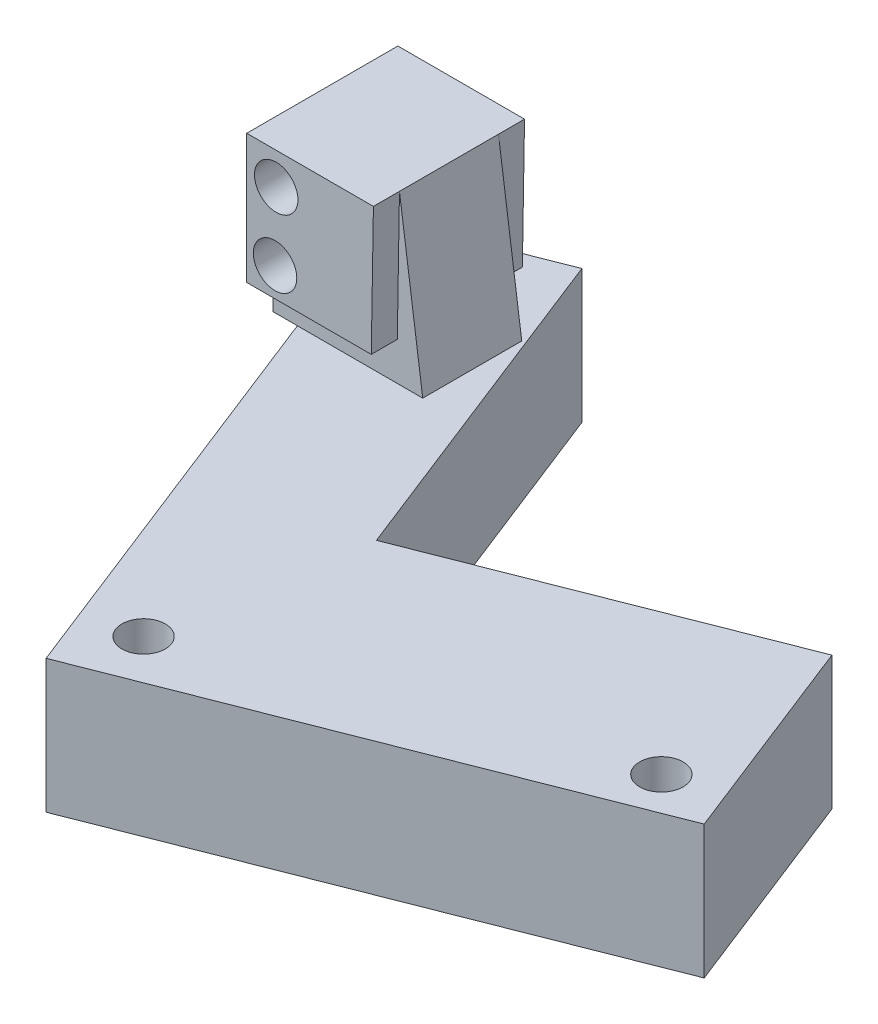
ISO-10303-21;
HEADER;
FILE_DESCRIPTION(('STEP AP214'),'2;1');
FILE_NAME('part.step','',(''),(''),'','','');
FILE_SCHEMA(('AUTOMOTIVE_DESIGN { 1 0 10303 214 1 1 1 1 }'));
ENDSEC;
DATA;
#1=APPLICATION_CONTEXT('core data for automotive mechanical design processes');
#2=APPLICATION_PROTOCOL_DEFINITION('international standard','automotive_design',2000,#1);
#3=PRODUCT_CONTEXT('',#1,'mechanical');
#4=PRODUCT('Part','Part','',(#3));
#5=PRODUCT_RELATED_PRODUCT_CATEGORY('part','',(#4));
#6=PRODUCT_DEFINITION_FORMATION('','',#4);
#7=PRODUCT_DEFINITION_CONTEXT('part definition',#1,'design');
#8=PRODUCT_DEFINITION('design','',#6,#7);
#9=PRODUCT_DEFINITION_SHAPE('','',#8);
#10=(LENGTH_UNIT() NAMED_UNIT(*) SI_UNIT(.MILLI.,.METRE.));
#11=(NAMED_UNIT(*) PLANE_ANGLE_UNIT() SI_UNIT($,.RADIAN.));
#12=(NAMED_UNIT(*) SI_UNIT($,.STERADIAN.) SOLID_ANGLE_UNIT());
#13=UNCERTAINTY_MEASURE_WITH_UNIT(LENGTH_MEASURE(1.E-05),#10,'distance_accuracy_value','');
#14=(GEOMETRIC_REPRESENTATION_CONTEXT(3) GLOBAL_UNCERTAINTY_ASSIGNED_CONTEXT((#13)) GLOBAL_UNIT_ASSIGNED_CONTEXT((#10,
#11,#12)) REPRESENTATION_CONTEXT('',''));
#15=CARTESIAN_POINT('',(0.,0.,0.));
#16=DIRECTION('',(0.,0.,1.));
#17=DIRECTION('',(1.,0.,0.));
#18=AXIS2_PLACEMENT_3D('',#15,#16,#17);
#19=CARTESIAN_POINT('',(449.174121077904,-7.46907661315017,-54.397912950041));
#20=DIRECTION('',(0.999861775722981,-0.0166261675706381,0.));
#21=DIRECTION('',(0.0166261675706381,0.999861775722981,0.));
#22=AXIS2_PLACEMENT_3D('',#19,#20,#21);
#23=PLANE('',#22);
#24=DIRECTION('',(0.,0.,1.));
#25=VECTOR('',#24,1.);
#26=CARTESIAN_POINT('',(451.546293611045,135.188251434978,-54.397912950041));
#27=LINE('',#26,#25);
#28=CARTESIAN_POINT('',(451.546293611045,135.188251434978,-3.81));
#29=VERTEX_POINT('',#28);
#30=CARTESIAN_POINT('',(451.546293611045,135.188251434978,0.));
#31=VERTEX_POINT('',#30);
#32=EDGE_CURVE('E234',#29,#31,#27,.T.);
#33=ORIENTED_EDGE('',*,*,#32,.T.);
#34=DIRECTION('',(-0.0166261675706381,-0.999861775722981,0.));
#35=VECTOR('',#34,1.);
#36=CARTESIAN_POINT('',(449.174121077904,-7.46907661315017,0.));
#37=LINE('',#36,#35);
#38=CARTESIAN_POINT('',(451.232045854327,116.29007067776,0.));
#39=VERTEX_POINT('',#38);
#40=EDGE_CURVE('E267',#31,#39,#37,.T.);
#41=ORIENTED_EDGE('',*,*,#40,.T.);
#42=DIRECTION('',(0.,0.,-1.));
#43=VECTOR('',#42,1.);
#44=CARTESIAN_POINT('',(451.232045854327,116.29007067776,-54.397912950041));
#45=LINE('',#44,#43);
#46=CARTESIAN_POINT('',(451.232045854327,116.29007067776,-3.81));
#47=VERTEX_POINT('',#46);
#48=EDGE_CURVE('E199',#39,#47,#45,.T.);
#49=ORIENTED_EDGE('',*,*,#48,.T.);
#50=DIRECTION('',(-0.0166261675706309,-0.999861775722981,0.));
#51=VECTOR('',#50,1.);
#52=CARTESIAN_POINT('',(451.546293611045,135.188251434978,-3.81));
#53=LINE('',#52,#51);
#54=EDGE_CURVE('E179',#29,#47,#53,.T.);
#55=ORIENTED_EDGE('',*,*,#54,.F.);
#56=EDGE_LOOP('',(#33,#41,#49,#55));
#57=FACE_BOUND('',#56,.T.);
#58=ADVANCED_FACE('F45',(#57),#23,.T.);
#59=DIRECTION('',(0.,0.,-1.));
#60=VECTOR('',#59,1.);
#61=CARTESIAN_POINT('',(451.232045854327,116.29007067776,-54.397912950041));
#62=LINE('',#61,#60);
#63=CARTESIAN_POINT('',(451.232045854327,116.29007067776,-18.2879999999998));
#64=VERTEX_POINT('',#63);
#65=CARTESIAN_POINT('',(451.232045854327,116.29007067776,-22.0979999999998));
#66=VERTEX_POINT('',#65);
#67=EDGE_CURVE('E196',#64,#66,#62,.T.);
#68=ORIENTED_EDGE('',*,*,#67,.T.);
#69=DIRECTION('',(0.0166261675706381,0.999861775722981,0.));
#70=VECTOR('',#69,1.);
#71=CARTESIAN_POINT('',(449.174121077904,-7.46907661315017,-22.0979999999998));
#72=LINE('',#71,#70);
#73=CARTESIAN_POINT('',(451.546293611045,135.188251434978,-22.0979999999998));
#74=VERTEX_POINT('',#73);
#75=EDGE_CURVE('E277',#66,#74,#72,.T.);
#76=ORIENTED_EDGE('',*,*,#75,.T.);
#77=CARTESIAN_POINT('',(451.546293611045,135.188251434978,-18.2879999999998));
#78=VERTEX_POINT('',#77);
#79=EDGE_CURVE('E272',#74,#78,#27,.T.);
#80=ORIENTED_EDGE('',*,*,#79,.T.);
#81=DIRECTION('',(-0.0166261675706309,-0.999861775722981,0.));
#82=VECTOR('',#81,1.);
#83=CARTESIAN_POINT('',(451.546293611045,135.188251434978,-18.2879999999998));
#84=LINE('',#83,#82);
#85=EDGE_CURVE('E165',#78,#64,#84,.T.);
#86=ORIENTED_EDGE('',*,*,#85,.T.);
#87=EDGE_LOOP('',(#68,#76,#80,#86));
#88=FACE_BOUND('',#87,.T.);
#89=ADVANCED_FACE('F300',(#88),#23,.T.);
#90=CARTESIAN_POINT('',(0.,110.70207067776,-2.32437182998327E-13));
#91=DIRECTION('',(0.,-1.,0.));
#92=DIRECTION('',(0.,0.,1.));
#93=AXIS2_PLACEMENT_3D('',#90,#91,#92);
#94=PLANE('',#93);
#95=CARTESIAN_POINT('',(464.715754045119,110.70207067776,46.7775128305649));
#96=DIRECTION('',(0.,-1.,0.));
#97=DIRECTION('',(0.,0.,-1.));
#98=AXIS2_PLACEMENT_3D('',#95,#96,#97);
#99=CIRCLE('',#98,3.17499999999997);
#100=CARTESIAN_POINT('',(464.715754045119,110.70207067776,43.6025128305649));
#101=VERTEX_POINT('',#100);
#102=EDGE_CURVE('E227',#101,#101,#99,.T.);
#103=ORIENTED_EDGE('',*,*,#102,.T.);
#104=EDGE_LOOP('',(#103));
#105=FACE_BOUND('',#104,.T.);
#106=CARTESIAN_POINT('',(520.043156994336,110.70207067776,26.3896372008954));
#107=DIRECTION('',(0.,-1.,0.));
#108=DIRECTION('',(0.,0.,-1.));
#109=AXIS2_PLACEMENT_3D('',#106,#107,#108);
#110=CIRCLE('',#109,3.17499999999997);
#111=CARTESIAN_POINT('',(520.043156994336,110.70207067776,23.2146372008955));
#112=VERTEX_POINT('',#111);
#113=EDGE_CURVE('E224',#112,#112,#110,.T.);
#114=ORIENTED_EDGE('',*,*,#113,.T.);
#115=EDGE_LOOP('',(#114));
#116=FACE_BOUND('',#115,.T.);
#117=DIRECTION('',(-1.,0.,0.));
#118=VECTOR('',#117,1.);
#119=CARTESIAN_POINT('',(459.183837090521,110.70207067776,-3.81));
#120=LINE('',#119,#118);
#121=CARTESIAN_POINT('',(454.94912598616,110.702070677759,-3.81));
#122=VERTEX_POINT('',#121);
#123=CARTESIAN_POINT('',(436.620084468477,110.70207067776,-3.81));
#124=VERTEX_POINT('',#123);
#125=EDGE_CURVE('E544',#122,#124,#120,.T.);
#126=ORIENTED_EDGE('',*,*,#125,.T.);
#127=DIRECTION('',(-0.365302013902893,0.,-0.930889058179593));
#128=VECTOR('',#127,1.);
#129=CARTESIAN_POINT('',(428.888999662309,110.70207067776,-23.5109104248551));
#130=LINE('',#129,#128);
#131=CARTESIAN_POINT('',(460.355497652672,110.70207067776,56.6742995210325));
#132=VERTEX_POINT('',#131);
#133=EDGE_CURVE('E53',#132,#124,#130,.T.);
#134=ORIENTED_EDGE('',*,*,#133,.F.);
#135=DIRECTION('',(-0.930889058179593,0.,0.365302013902894));
#136=VECTOR('',#135,1.);
#137=CARTESIAN_POINT('',(460.355497652672,110.70207067776,56.6742995210325));
#138=LINE('',#137,#136);
#139=CARTESIAN_POINT('',(529.469948870299,110.70207067776,29.5522187556127));
#140=VERTEX_POINT('',#139);
#141=EDGE_CURVE('E204',#140,#132,#138,.T.);
#142=ORIENTED_EDGE('',*,*,#141,.F.);
#143=DIRECTION('',(0.365302013902893,0.,0.930889058179593));
#144=VECTOR('',#143,1.);
#145=CARTESIAN_POINT('',(529.469948870299,110.70207067776,29.5522187556127));
#146=LINE('',#145,#144);
#147=CARTESIAN_POINT('',(517.407676371226,110.70207067776,-1.18573794547745));
#148=VERTEX_POINT('',#147);
#149=EDGE_CURVE('E208',#148,#140,#146,.T.);
#150=ORIENTED_EDGE('',*,*,#149,.F.);
#151=DIRECTION('',(0.930889058179593,0.,-0.365302013902894));
#152=VECTOR('',#151,1.);
#153=CARTESIAN_POINT('',(517.407676371226,110.70207067776,-1.18573794547745));
#154=LINE('',#153,#152);
#155=CARTESIAN_POINT('',(469.573349023584,110.70207067776,17.5855387821221));
#156=VERTEX_POINT('',#155);
#157=EDGE_CURVE('E211',#156,#148,#154,.T.);
#158=ORIENTED_EDGE('',*,*,#157,.F.);
#159=DIRECTION('',(0.365302013902893,0.,0.930889058179594));
#160=VECTOR('',#159,1.);
#161=CARTESIAN_POINT('',(469.573349023584,110.70207067776,17.5855387821221));
#162=LINE('',#161,#160);
#163=CARTESIAN_POINT('',(450.169123532295,110.70207067776,-31.8617144626753));
#164=VERTEX_POINT('',#163);
#165=EDGE_CURVE('E214',#164,#156,#162,.T.);
#166=ORIENTED_EDGE('',*,*,#165,.F.);
#167=DIRECTION('',(0.930889058179594,0.,-0.365302013902893));
#168=VECTOR('',#167,1.);
#169=CARTESIAN_POINT('',(450.169123532295,110.70207067776,-31.8617144626753));
#170=LINE('',#169,#168);
#171=CARTESIAN_POINT('',(428.888999662309,110.70207067776,-23.5109104248551));
#172=VERTEX_POINT('',#171);
#173=EDGE_CURVE('E217',#172,#164,#170,.T.);
#174=ORIENTED_EDGE('',*,*,#173,.F.);
#175=CARTESIAN_POINT('',(433.021837090521,110.702070677759,-12.9793146637115));
#176=VERTEX_POINT('',#175);
#177=EDGE_CURVE('E220',#176,#172,#130,.T.);
#178=ORIENTED_EDGE('',*,*,#177,.F.);
#179=DIRECTION('',(0.,0.,1.));
#180=VECTOR('',#179,1.);
#181=CARTESIAN_POINT('',(433.021837090521,110.702070677759,-28.702));
#182=LINE('',#181,#180);
#183=CARTESIAN_POINT('',(433.021837090521,110.702070677759,-18.2879999999998));
#184=VERTEX_POINT('',#183);
#185=EDGE_CURVE('E184',#184,#176,#182,.T.);
#186=ORIENTED_EDGE('',*,*,#185,.F.);
#187=DIRECTION('',(-1.,0.,0.));
#188=VECTOR('',#187,1.);
#189=CARTESIAN_POINT('',(459.183837090521,110.70207067776,-18.2879999999998));
#190=LINE('',#189,#188);
#191=CARTESIAN_POINT('',(454.94912598616,110.702070677759,-18.2879999999998));
#192=VERTEX_POINT('',#191);
#193=EDGE_CURVE('E162',#192,#184,#190,.T.);
#194=ORIENTED_EDGE('',*,*,#193,.F.);
#195=DIRECTION('',(0.,0.,-1.));
#196=VECTOR('',#195,1.);
#197=CARTESIAN_POINT('',(454.94912598616,110.702070677759,20.9708221831963));
#198=LINE('',#197,#196);
#199=EDGE_CURVE('E173',#122,#192,#198,.T.);
#200=ORIENTED_EDGE('',*,*,#199,.F.);
#201=EDGE_LOOP('',(#126,#134,#142,#150,#158,#166,#174,#178,#186,#194,#200));
#202=FACE_BOUND('',#201,.T.);
#203=ADVANCED_FACE('F181',(#105,#116,#202),#94,.F.);
#204=CARTESIAN_POINT('',(0.,110.70207067776,-54.397912950041));
#205=DIRECTION('',(0.,-1.,0.));
#206=DIRECTION('',(0.,0.,1.));
#207=AXIS2_PLACEMENT_3D('',#204,#205,#206);
#208=PLANE('',#207);
#209=CARTESIAN_POINT('',(433.021837090521,110.702070677759,-3.81));
#210=VERTEX_POINT('',#209);
#211=EDGE_CURVE('E563',#176,#210,#182,.T.);
#212=ORIENTED_EDGE('',*,*,#211,.F.);
#213=EDGE_CURVE('E221',#124,#176,#130,.T.);
#214=ORIENTED_EDGE('',*,*,#213,.F.);
#215=EDGE_CURVE('E564',#124,#210,#120,.T.);
#216=ORIENTED_EDGE('',*,*,#215,.T.);
#217=EDGE_LOOP('',(#212,#214,#216));
#218=FACE_BOUND('',#217,.T.);
#219=ADVANCED_FACE('F311',(#218),#208,.T.);
#220=CARTESIAN_POINT('',(0.,135.188251434978,-54.397912950041));
#221=DIRECTION('',(0.,1.,0.));
#222=DIRECTION('',(0.,0.,-1.));
#223=AXIS2_PLACEMENT_3D('',#220,#221,#222);
#224=PLANE('',#223);
#225=DIRECTION('',(0.,0.,1.));
#226=VECTOR('',#225,1.);
#227=CARTESIAN_POINT('',(433.021837090521,135.188251434978,-28.702));
#228=LINE('',#227,#226);
#229=CARTESIAN_POINT('',(433.021837090521,135.188251434978,-22.0979999999998));
#230=VERTEX_POINT('',#229);
#231=CARTESIAN_POINT('',(433.021837090521,135.188251434978,0.));
#232=VERTEX_POINT('',#231);
#233=EDGE_CURVE('E568',#230,#232,#228,.T.);
#234=ORIENTED_EDGE('',*,*,#233,.T.);
#235=DIRECTION('',(1.,0.,0.));
#236=VECTOR('',#235,1.);
#237=CARTESIAN_POINT('',(0.,135.188251434978,0.));
#238=LINE('',#237,#236);
#239=EDGE_CURVE('E270',#232,#31,#238,.T.);
#240=ORIENTED_EDGE('',*,*,#239,.T.);
#241=ORIENTED_EDGE('',*,*,#32,.F.);
#242=DIRECTION('',(0.,0.,-1.));
#243=VECTOR('',#242,1.);
#244=CARTESIAN_POINT('',(451.546293611045,135.188251434978,20.9708221831963));
#245=LINE('',#244,#243);
#246=EDGE_CURVE('E170',#29,#78,#245,.T.);
#247=ORIENTED_EDGE('',*,*,#246,.T.);
#248=ORIENTED_EDGE('',*,*,#79,.F.);
#249=DIRECTION('',(-1.,0.,0.));
#250=VECTOR('',#249,1.);
#251=CARTESIAN_POINT('',(0.,135.188251434978,-22.0979999999998));
#252=LINE('',#251,#250);
#253=EDGE_CURVE('E67',#74,#230,#252,.T.);
#254=ORIENTED_EDGE('',*,*,#253,.T.);
#255=EDGE_LOOP('',(#234,#240,#241,#247,#248,#254));
#256=FACE_BOUND('',#255,.T.);
#257=ADVANCED_FACE('F314',(#256),#224,.T.);
#258=CARTESIAN_POINT('',(437.164813365978,120.500000000002,-54.397912950041));
#259=DIRECTION('',(0.,0.,1.));
#260=DIRECTION('',(-1.,0.,0.));
#261=AXIS2_PLACEMENT_3D('',#258,#259,#260);
#262=CYLINDRICAL_SURFACE('',#261,3.17500000000002);
#263=CARTESIAN_POINT('',(437.164813365978,120.500000000002,-22.0979999999998));
#264=DIRECTION('',(0.,0.,-1.));
#265=DIRECTION('',(-1.,0.,0.));
#266=AXIS2_PLACEMENT_3D('',#263,#264,#265);
#267=CIRCLE('',#266,3.17500000000002);
#268=CARTESIAN_POINT('',(433.989813365978,120.500000000002,-22.0979999999998));
#269=VERTEX_POINT('',#268);
#270=EDGE_CURVE('E263',#269,#269,#267,.T.);
#271=ORIENTED_EDGE('',*,*,#270,.T.);
#272=EDGE_LOOP('',(#271));
#273=FACE_BOUND('',#272,.T.);
#274=CARTESIAN_POINT('',(437.164813365978,120.500000000002,0.));
#275=DIRECTION('',(0.,0.,1.));
#276=DIRECTION('',(1.,0.,0.));
#277=AXIS2_PLACEMENT_3D('',#274,#275,#276);
#278=CIRCLE('',#277,3.17500000000002);
#279=CARTESIAN_POINT('',(440.339813365979,120.500000000002,0.));
#280=VERTEX_POINT('',#279);
#281=EDGE_CURVE('E264',#280,#280,#278,.T.);
#282=ORIENTED_EDGE('',*,*,#281,.T.);
#283=EDGE_LOOP('',(#282));
#284=FACE_BOUND('',#283,.T.);
#285=ADVANCED_FACE('F310',(#273,#284),#262,.F.);
#286=CARTESIAN_POINT('',(437.331098026262,130.500000000002,-54.397912950041));
#287=DIRECTION('',(0.,0.,1.));
#288=DIRECTION('',(-1.,0.,0.));
#289=AXIS2_PLACEMENT_3D('',#286,#287,#288);
#290=CYLINDRICAL_SURFACE('',#289,3.17499999999997);
#291=CARTESIAN_POINT('',(437.331098026262,130.500000000002,-22.0979999999998));
#292=DIRECTION('',(0.,0.,-1.));
#293=DIRECTION('',(-1.,0.,0.));
#294=AXIS2_PLACEMENT_3D('',#291,#292,#293);
#295=CIRCLE('',#294,3.17499999999997);
#296=CARTESIAN_POINT('',(434.156098026262,130.500000000002,-22.0979999999998));
#297=VERTEX_POINT('',#296);
#298=EDGE_CURVE('E223',#297,#297,#295,.T.);
#299=ORIENTED_EDGE('',*,*,#298,.T.);
#300=EDGE_LOOP('',(#299));
#301=FACE_BOUND('',#300,.T.);
#302=CARTESIAN_POINT('',(437.331098026262,130.500000000002,0.));
#303=DIRECTION('',(0.,0.,1.));
#304=DIRECTION('',(1.,0.,0.));
#305=AXIS2_PLACEMENT_3D('',#302,#303,#304);
#306=CIRCLE('',#305,3.17499999999997);
#307=CARTESIAN_POINT('',(440.506098026262,130.500000000002,0.));
#308=VERTEX_POINT('',#307);
#309=EDGE_CURVE('E260',#308,#308,#306,.T.);
#310=ORIENTED_EDGE('',*,*,#309,.T.);
#311=EDGE_LOOP('',(#310));
#312=FACE_BOUND('',#311,.T.);
#313=ADVANCED_FACE('F282',(#301,#312),#290,.F.);
#314=CARTESIAN_POINT('',(0.,0.,0.));
#315=DIRECTION('',(0.,0.,-1.));
#316=DIRECTION('',(1.,0.,0.));
#317=AXIS2_PLACEMENT_3D('',#314,#315,#316);
#318=PLANE('',#317);
#319=DIRECTION('',(-1.,0.,0.));
#320=VECTOR('',#319,1.);
#321=CARTESIAN_POINT('',(459.183837090521,116.29007067776,0.));
#322=LINE('',#321,#320);
#323=CARTESIAN_POINT('',(433.021837090521,116.29007067776,0.));
#324=VERTEX_POINT('',#323);
#325=EDGE_CURVE('E200',#39,#324,#322,.T.);
#326=ORIENTED_EDGE('',*,*,#325,.F.);
#327=ORIENTED_EDGE('',*,*,#40,.F.);
#328=ORIENTED_EDGE('',*,*,#239,.F.);
#329=DIRECTION('',(0.,-1.,0.));
#330=VECTOR('',#329,1.);
#331=CARTESIAN_POINT('',(433.021837090521,135.188251434978,0.));
#332=LINE('',#331,#330);
#333=EDGE_CURVE('E565',#232,#324,#332,.T.);
#334=ORIENTED_EDGE('',*,*,#333,.T.);
#335=EDGE_LOOP('',(#326,#327,#328,#334));
#336=FACE_BOUND('',#335,.T.);
#337=ORIENTED_EDGE('',*,*,#281,.F.);
#338=EDGE_LOOP('',(#337));
#339=FACE_BOUND('',#338,.T.);
#340=ORIENTED_EDGE('',*,*,#309,.F.);
#341=EDGE_LOOP('',(#340));
#342=FACE_BOUND('',#341,.T.);
#343=ADVANCED_FACE('F287',(#336,#339,#342),#318,.F.);
#344=CARTESIAN_POINT('',(405.259993131351,116.453404428401,-22.0979999999998));
#345=DIRECTION('',(0.,0.,1.));
#346=DIRECTION('',(-1.,0.,0.));
#347=AXIS2_PLACEMENT_3D('',#344,#345,#346);
#348=PLANE('',#347);
#349=ORIENTED_EDGE('',*,*,#270,.F.);
#350=EDGE_LOOP('',(#349));
#351=FACE_BOUND('',#350,.T.);
#352=ORIENTED_EDGE('',*,*,#253,.F.);
#353=ORIENTED_EDGE('',*,*,#75,.F.);
#354=DIRECTION('',(-1.,0.,0.));
#355=VECTOR('',#354,1.);
#356=CARTESIAN_POINT('',(459.183837090521,116.29007067776,-22.0979999999998));
#357=LINE('',#356,#355);
#358=CARTESIAN_POINT('',(433.021837090521,116.29007067776,-22.0979999999998));
#359=VERTEX_POINT('',#358);
#360=EDGE_CURVE('E189',#66,#359,#357,.T.);
#361=ORIENTED_EDGE('',*,*,#360,.T.);
#362=DIRECTION('',(0.,-1.,0.));
#363=VECTOR('',#362,1.);
#364=CARTESIAN_POINT('',(433.021837090521,116.453404428401,-22.0979999999998));
#365=LINE('',#364,#363);
#366=EDGE_CURVE('E186',#230,#359,#365,.T.);
#367=ORIENTED_EDGE('',*,*,#366,.F.);
#368=EDGE_LOOP('',(#352,#353,#361,#367));
#369=FACE_BOUND('',#368,.T.);
#370=ORIENTED_EDGE('',*,*,#298,.F.);
#371=EDGE_LOOP('',(#370));
#372=FACE_BOUND('',#371,.T.);
#373=ADVANCED_FACE('F47',(#351,#369,#372),#348,.F.);
#374=CARTESIAN_POINT('',(428.888999662309,-42.7854399467057,-23.5109104248548));
#375=DIRECTION('',(-0.930889058179593,0.,0.365302013902893));
#376=DIRECTION('',(-0.365302013902893,0.,-0.930889058179593));
#377=AXIS2_PLACEMENT_3D('',#374,#375,#376);
#378=PLANE('',#377);
#379=DIRECTION('',(0.,1.,0.));
#380=VECTOR('',#379,1.);
#381=CARTESIAN_POINT('',(460.355497652672,-42.7854399467055,56.6742995210328));
#382=LINE('',#381,#380);
#383=CARTESIAN_POINT('',(460.355497652672,91.2114000000019,56.6742995210325));
#384=VERTEX_POINT('',#383);
#385=EDGE_CURVE('E245',#384,#132,#382,.T.);
#386=ORIENTED_EDGE('',*,*,#385,.T.);
#387=ORIENTED_EDGE('',*,*,#133,.T.);
#388=ORIENTED_EDGE('',*,*,#213,.T.);
#389=ORIENTED_EDGE('',*,*,#177,.T.);
#390=DIRECTION('',(0.,1.,0.));
#391=VECTOR('',#390,1.);
#392=CARTESIAN_POINT('',(428.888999662309,-42.7854399467057,-23.5109104248548));
#393=LINE('',#392,#391);
#394=CARTESIAN_POINT('',(428.888999662309,91.2114000000017,-23.5109104248551));
#395=VERTEX_POINT('',#394);
#396=EDGE_CURVE('E242',#395,#172,#393,.T.);
#397=ORIENTED_EDGE('',*,*,#396,.F.);
#398=DIRECTION('',(-0.365302013902893,0.,-0.930889058179593));
#399=VECTOR('',#398,1.);
#400=CARTESIAN_POINT('',(428.888999662309,91.2114000000017,-23.5109104248551));
#401=LINE('',#400,#399);
#402=EDGE_CURVE('E203',#384,#395,#401,.T.);
#403=ORIENTED_EDGE('',*,*,#402,.F.);
#404=EDGE_LOOP('',(#386,#387,#388,#389,#397,#403));
#405=FACE_BOUND('',#404,.T.);
#406=ADVANCED_FACE('F286',(#405),#378,.T.);
#407=CARTESIAN_POINT('',(460.355497652672,-42.7854399467055,56.6742995210328));
#408=DIRECTION('',(0.365302013902894,0.,0.930889058179593));
#409=DIRECTION('',(-0.930889058179593,0.,0.365302013902894));
#410=AXIS2_PLACEMENT_3D('',#407,#408,#409);
#411=PLANE('',#410);
#412=DIRECTION('',(0.,1.,0.));
#413=VECTOR('',#412,1.);
#414=CARTESIAN_POINT('',(529.469948870299,-42.7854399467055,29.552218755613));
#415=LINE('',#414,#413);
#416=CARTESIAN_POINT('',(529.469948870299,91.2114000000019,29.552218755613));
#417=VERTEX_POINT('',#416);
#418=EDGE_CURVE('E248',#417,#140,#415,.T.);
#419=ORIENTED_EDGE('',*,*,#418,.T.);
#420=ORIENTED_EDGE('',*,*,#141,.T.);
#421=ORIENTED_EDGE('',*,*,#385,.F.);
#422=DIRECTION('',(-0.930889058179593,0.,0.365302013902894));
#423=VECTOR('',#422,1.);
#424=CARTESIAN_POINT('',(460.355497652672,91.2114000000019,56.6742995210325));
#425=LINE('',#424,#423);
#426=EDGE_CURVE('E243',#417,#384,#425,.T.);
#427=ORIENTED_EDGE('',*,*,#426,.F.);
#428=EDGE_LOOP('',(#419,#420,#421,#427));
#429=FACE_BOUND('',#428,.T.);
#430=ADVANCED_FACE('F293',(#429),#411,.T.);
#431=CARTESIAN_POINT('',(529.469948870299,-42.7854399467055,29.552218755613));
#432=DIRECTION('',(0.930889058179593,0.,-0.365302013902893));
#433=DIRECTION('',(0.365302013902894,0.,0.930889058179593));
#434=AXIS2_PLACEMENT_3D('',#431,#432,#433);
#435=PLANE('',#434);
#436=DIRECTION('',(0.,1.,0.));
#437=VECTOR('',#436,1.);
#438=CARTESIAN_POINT('',(517.407676371226,-42.7854399467056,-1.18573794547713));
#439=LINE('',#438,#437);
#440=CARTESIAN_POINT('',(517.407676371226,91.2114000000018,-1.18573794547747));
#441=VERTEX_POINT('',#440);
#442=EDGE_CURVE('E251',#441,#148,#439,.T.);
#443=ORIENTED_EDGE('',*,*,#442,.T.);
#444=ORIENTED_EDGE('',*,*,#149,.T.);
#445=ORIENTED_EDGE('',*,*,#418,.F.);
#446=DIRECTION('',(0.365302013902894,0.,0.930889058179593));
#447=VECTOR('',#446,1.);
#448=CARTESIAN_POINT('',(529.469948870299,91.2114000000019,29.5522187556128));
#449=LINE('',#448,#447);
#450=EDGE_CURVE('E246',#441,#417,#449,.T.);
#451=ORIENTED_EDGE('',*,*,#450,.F.);
#452=EDGE_LOOP('',(#443,#444,#445,#451));
#453=FACE_BOUND('',#452,.T.);
#454=ADVANCED_FACE('F483',(#453),#435,.T.);
#455=CARTESIAN_POINT('',(517.407676371226,-42.7854399467056,-1.18573794547713));
#456=DIRECTION('',(-0.365302013902894,0.,-0.930889058179593));
#457=DIRECTION('',(0.930889058179593,0.,-0.365302013902894));
#458=AXIS2_PLACEMENT_3D('',#455,#456,#457);
#459=PLANE('',#458);
#460=DIRECTION('',(0.,1.,0.));
#461=VECTOR('',#460,1.);
#462=CARTESIAN_POINT('',(469.573349023584,-42.7854399467056,17.5855387821224));
#463=LINE('',#462,#461);
#464=CARTESIAN_POINT('',(469.573349023584,91.2114000000018,17.5855387821224));
#465=VERTEX_POINT('',#464);
#466=EDGE_CURVE('E239',#465,#156,#463,.T.);
#467=ORIENTED_EDGE('',*,*,#466,.T.);
#468=ORIENTED_EDGE('',*,*,#157,.T.);
#469=ORIENTED_EDGE('',*,*,#442,.F.);
#470=DIRECTION('',(0.930889058179593,0.,-0.365302013902894));
#471=VECTOR('',#470,1.);
#472=CARTESIAN_POINT('',(517.407676371226,91.2114000000018,-1.18573794547741));
#473=LINE('',#472,#471);
#474=EDGE_CURVE('E249',#465,#441,#473,.T.);
#475=ORIENTED_EDGE('',*,*,#474,.F.);
#476=EDGE_LOOP('',(#467,#468,#469,#475));
#477=FACE_BOUND('',#476,.T.);
#478=ADVANCED_FACE('F475',(#477),#459,.T.);
#479=CARTESIAN_POINT('',(469.573349023584,-42.7854399467056,17.5855387821224));
#480=DIRECTION('',(0.930889058179593,0.,-0.365302013902893));
#481=DIRECTION('',(0.365302013902893,0.,0.930889058179593));
#482=AXIS2_PLACEMENT_3D('',#479,#480,#481);
#483=PLANE('',#482);
#484=DIRECTION('',(0.,1.,0.));
#485=VECTOR('',#484,1.);
#486=CARTESIAN_POINT('',(450.169123532295,-42.7854399467057,-31.8617144626749));
#487=LINE('',#486,#485);
#488=CARTESIAN_POINT('',(450.169123532295,91.2114000000017,-31.8617144626752));
#489=VERTEX_POINT('',#488);
#490=EDGE_CURVE('E228',#489,#164,#487,.T.);
#491=ORIENTED_EDGE('',*,*,#490,.T.);
#492=ORIENTED_EDGE('',*,*,#165,.T.);
#493=ORIENTED_EDGE('',*,*,#466,.F.);
#494=DIRECTION('',(0.365302013902893,0.,0.930889058179593));
#495=VECTOR('',#494,1.);
#496=CARTESIAN_POINT('',(469.573349023584,91.2114000000018,17.5855387821221));
#497=LINE('',#496,#495);
#498=EDGE_CURVE('E252',#489,#465,#497,.T.);
#499=ORIENTED_EDGE('',*,*,#498,.F.);
#500=EDGE_LOOP('',(#491,#492,#493,#499));
#501=FACE_BOUND('',#500,.T.);
#502=ADVANCED_FACE('F372',(#501),#483,.T.);
#503=CARTESIAN_POINT('',(450.169123532295,-42.7854399467057,-31.8617144626749));
#504=DIRECTION('',(-0.365302013902893,0.,-0.930889058179594));
#505=DIRECTION('',(0.930889058179594,0.,-0.365302013902893));
#506=AXIS2_PLACEMENT_3D('',#503,#504,#505);
#507=PLANE('',#506);
#508=ORIENTED_EDGE('',*,*,#396,.T.);
#509=ORIENTED_EDGE('',*,*,#173,.T.);
#510=ORIENTED_EDGE('',*,*,#490,.F.);
#511=DIRECTION('',(0.930889058179594,0.,-0.365302013902893));
#512=VECTOR('',#511,1.);
#513=CARTESIAN_POINT('',(450.169123532295,91.2114000000017,-31.8617144626752));
#514=LINE('',#513,#512);
#515=EDGE_CURVE('E237',#395,#489,#514,.T.);
#516=ORIENTED_EDGE('',*,*,#515,.F.);
#517=EDGE_LOOP('',(#508,#509,#510,#516));
#518=FACE_BOUND('',#517,.T.);
#519=ADVANCED_FACE('F459',(#518),#507,.T.);
#520=CARTESIAN_POINT('',(520.043156994336,-42.7854399467055,26.3896372008957));
#521=DIRECTION('',(0.,1.,0.));
#522=DIRECTION('',(0.,0.,-1.));
#523=AXIS2_PLACEMENT_3D('',#520,#521,#522);
#524=CYLINDRICAL_SURFACE('',#523,3.17499999999997);
#525=ORIENTED_EDGE('',*,*,#113,.F.);
#526=EDGE_LOOP('',(#525));
#527=FACE_BOUND('',#526,.T.);
#528=CARTESIAN_POINT('',(520.043156994336,91.2114000000019,26.3896372008955));
#529=DIRECTION('',(0.,1.,0.));
#530=DIRECTION('',(0.,0.,1.));
#531=AXIS2_PLACEMENT_3D('',#528,#529,#530);
#532=CIRCLE('',#531,3.17499999999997);
#533=CARTESIAN_POINT('',(520.043156994336,91.2114000000019,29.5646372008954));
#534=VERTEX_POINT('',#533);
#535=EDGE_CURVE('E231',#534,#534,#532,.F.);
#536=ORIENTED_EDGE('',*,*,#535,.T.);
#537=EDGE_LOOP('',(#536));
#538=FACE_BOUND('',#537,.T.);
#539=ADVANCED_FACE('F450',(#527,#538),#524,.F.);
#540=CARTESIAN_POINT('',(464.715754045119,-42.7854399467055,46.7775128305652));
#541=DIRECTION('',(0.,1.,0.));
#542=DIRECTION('',(0.,0.,-1.));
#543=AXIS2_PLACEMENT_3D('',#540,#541,#542);
#544=CYLINDRICAL_SURFACE('',#543,3.17499999999997);
#545=ORIENTED_EDGE('',*,*,#102,.F.);
#546=EDGE_LOOP('',(#545));
#547=FACE_BOUND('',#546,.T.);
#548=CARTESIAN_POINT('',(464.715754045119,91.2114000000019,46.7775128305649));
#549=DIRECTION('',(0.,1.,0.));
#550=DIRECTION('',(0.,0.,1.));
#551=AXIS2_PLACEMENT_3D('',#548,#549,#550);
#552=CIRCLE('',#551,3.17499999999997);
#553=CARTESIAN_POINT('',(464.715754045119,91.2114000000019,49.9525128305649));
#554=VERTEX_POINT('',#553);
#555=EDGE_CURVE('E207',#554,#554,#552,.F.);
#556=ORIENTED_EDGE('',*,*,#555,.T.);
#557=EDGE_LOOP('',(#556));
#558=FACE_BOUND('',#557,.T.);
#559=ADVANCED_FACE('F441',(#547,#558),#544,.F.);
#560=CARTESIAN_POINT('',(520.043156994336,91.2114000000019,26.3896372008957));
#561=DIRECTION('',(0.,-1.,0.));
#562=DIRECTION('',(0.802673987381068,0.,0.596418032911294));
#563=AXIS2_PLACEMENT_3D('',#560,#561,#562);
#564=PLANE('',#563);
#565=ORIENTED_EDGE('',*,*,#402,.T.);
#566=ORIENTED_EDGE('',*,*,#515,.T.);
#567=ORIENTED_EDGE('',*,*,#498,.T.);
#568=ORIENTED_EDGE('',*,*,#474,.T.);
#569=ORIENTED_EDGE('',*,*,#450,.T.);
#570=ORIENTED_EDGE('',*,*,#426,.T.);
#571=EDGE_LOOP('',(#565,#566,#567,#568,#569,#570));
#572=FACE_BOUND('',#571,.T.);
#573=ORIENTED_EDGE('',*,*,#555,.F.);
#574=EDGE_LOOP('',(#573));
#575=FACE_BOUND('',#574,.T.);
#576=ORIENTED_EDGE('',*,*,#535,.F.);
#577=EDGE_LOOP('',(#576));
#578=FACE_BOUND('',#577,.T.);
#579=ADVANCED_FACE('F381',(#572,#575,#578),#564,.T.);
#580=CARTESIAN_POINT('',(459.183837090521,110.70207067776,-18.2879999999998));
#581=DIRECTION('',(0.,0.,1.));
#582=DIRECTION('',(-1.,0.,0.));
#583=AXIS2_PLACEMENT_3D('',#580,#581,#582);
#584=PLANE('',#583);
#585=DIRECTION('',(-1.,0.,0.));
#586=VECTOR('',#585,1.);
#587=CARTESIAN_POINT('',(459.183837090521,116.29007067776,-18.2879999999998));
#588=LINE('',#587,#586);
#589=CARTESIAN_POINT('',(433.021837090521,116.29007067776,-18.2879999999998));
#590=VERTEX_POINT('',#589);
#591=EDGE_CURVE('E185',#64,#590,#588,.T.);
#592=ORIENTED_EDGE('',*,*,#591,.F.);
#593=ORIENTED_EDGE('',*,*,#85,.F.);
#594=DIRECTION('',(-0.137646706711603,0.990481390098497,0.));
#595=VECTOR('',#594,1.);
#596=CARTESIAN_POINT('',(454.94912598616,110.702070677759,-18.2879999999998));
#597=LINE('',#596,#595);
#598=EDGE_CURVE('E157',#192,#78,#597,.T.);
#599=ORIENTED_EDGE('',*,*,#598,.F.);
#600=ORIENTED_EDGE('',*,*,#193,.T.);
#601=DIRECTION('',(0.,-1.,0.));
#602=VECTOR('',#601,1.);
#603=CARTESIAN_POINT('',(433.021837090521,110.70207067776,-18.2879999999998));
#604=LINE('',#603,#602);
#605=EDGE_CURVE('E192',#590,#184,#604,.T.);
#606=ORIENTED_EDGE('',*,*,#605,.F.);
#607=EDGE_LOOP('',(#592,#593,#599,#600,#606));
#608=FACE_BOUND('',#607,.T.);
#609=ADVANCED_FACE('F159',(#608),#584,.F.);
#610=CARTESIAN_POINT('',(459.183837090521,116.29007067776,-22.0979999999998));
#611=DIRECTION('',(0.,1.,0.));
#612=DIRECTION('',(0.,0.,-1.));
#613=AXIS2_PLACEMENT_3D('',#610,#611,#612);
#614=PLANE('',#613);
#615=ORIENTED_EDGE('',*,*,#360,.F.);
#616=ORIENTED_EDGE('',*,*,#67,.F.);
#617=ORIENTED_EDGE('',*,*,#591,.T.);
#618=DIRECTION('',(0.,0.,1.));
#619=VECTOR('',#618,1.);
#620=CARTESIAN_POINT('',(433.021837090521,116.29007067776,-22.0979999999998));
#621=LINE('',#620,#619);
#622=EDGE_CURVE('E575',#359,#590,#621,.T.);
#623=ORIENTED_EDGE('',*,*,#622,.F.);
#624=EDGE_LOOP('',(#615,#616,#617,#623));
#625=FACE_BOUND('',#624,.T.);
#626=ADVANCED_FACE('F380',(#625),#614,.F.);
#627=CARTESIAN_POINT('',(459.183837090521,116.29007067776,0.));
#628=DIRECTION('',(0.,1.,0.));
#629=DIRECTION('',(0.,0.,-1.));
#630=AXIS2_PLACEMENT_3D('',#627,#628,#629);
#631=PLANE('',#630);
#632=DIRECTION('',(-1.,0.,0.));
#633=VECTOR('',#632,1.);
#634=CARTESIAN_POINT('',(459.183837090521,116.29007067776,-3.81));
#635=LINE('',#634,#633);
#636=CARTESIAN_POINT('',(433.021837090521,116.29007067776,-3.81));
#637=VERTEX_POINT('',#636);
#638=EDGE_CURVE('E580',#47,#637,#635,.T.);
#639=ORIENTED_EDGE('',*,*,#638,.F.);
#640=ORIENTED_EDGE('',*,*,#48,.F.);
#641=ORIENTED_EDGE('',*,*,#325,.T.);
#642=DIRECTION('',(0.,0.,1.));
#643=VECTOR('',#642,1.);
#644=CARTESIAN_POINT('',(433.021837090521,116.29007067776,0.));
#645=LINE('',#644,#643);
#646=EDGE_CURVE('E570',#637,#324,#645,.T.);
#647=ORIENTED_EDGE('',*,*,#646,.F.);
#648=EDGE_LOOP('',(#639,#640,#641,#647));
#649=FACE_BOUND('',#648,.T.);
#650=ADVANCED_FACE('F391',(#649),#631,.F.);
#651=CARTESIAN_POINT('',(459.183837090521,110.70207067776,-3.81));
#652=DIRECTION('',(0.,0.,-1.));
#653=DIRECTION('',(1.,0.,0.));
#654=AXIS2_PLACEMENT_3D('',#651,#652,#653);
#655=PLANE('',#654);
#656=ORIENTED_EDGE('',*,*,#215,.F.);
#657=ORIENTED_EDGE('',*,*,#125,.F.);
#658=DIRECTION('',(-0.137646706711603,0.990481390098497,0.));
#659=VECTOR('',#658,1.);
#660=CARTESIAN_POINT('',(454.94912598616,110.702070677759,-3.81));
#661=LINE('',#660,#659);
#662=EDGE_CURVE('E175',#122,#29,#661,.T.);
#663=ORIENTED_EDGE('',*,*,#662,.T.);
#664=ORIENTED_EDGE('',*,*,#54,.T.);
#665=ORIENTED_EDGE('',*,*,#638,.T.);
#666=DIRECTION('',(0.,1.,0.));
#667=VECTOR('',#666,1.);
#668=CARTESIAN_POINT('',(433.021837090521,110.70207067776,-3.81));
#669=LINE('',#668,#667);
#670=EDGE_CURVE('E11',#210,#637,#669,.T.);
#671=ORIENTED_EDGE('',*,*,#670,.F.);
#672=EDGE_LOOP('',(#656,#657,#663,#664,#665,#671));
#673=FACE_BOUND('',#672,.T.);
#674=ADVANCED_FACE('F397',(#673),#655,.F.);
#675=CARTESIAN_POINT('',(433.021837090521,135.188251434978,-28.702));
#676=DIRECTION('',(1.,0.,0.));
#677=DIRECTION('',(0.,0.,1.));
#678=AXIS2_PLACEMENT_3D('',#675,#676,#677);
#679=PLANE('',#678);
#680=ORIENTED_EDGE('',*,*,#233,.F.);
#681=ORIENTED_EDGE('',*,*,#366,.T.);
#682=ORIENTED_EDGE('',*,*,#622,.T.);
#683=ORIENTED_EDGE('',*,*,#605,.T.);
#684=ORIENTED_EDGE('',*,*,#185,.T.);
#685=ORIENTED_EDGE('',*,*,#211,.T.);
#686=ORIENTED_EDGE('',*,*,#670,.T.);
#687=ORIENTED_EDGE('',*,*,#646,.T.);
#688=ORIENTED_EDGE('',*,*,#333,.F.);
#689=EDGE_LOOP('',(#680,#681,#682,#683,#684,#685,#686,#687,#688));
#690=FACE_BOUND('',#689,.T.);
#691=ADVANCED_FACE('F402',(#690),#679,.F.);
#692=CARTESIAN_POINT('',(454.94912598616,110.702070677759,20.9708221831963));
#693=DIRECTION('',(-0.990481390098496,-0.137646706711603,0.));
#694=DIRECTION('',(0.137646706711603,-0.990481390098497,0.));
#695=AXIS2_PLACEMENT_3D('',#692,#693,#694);
#696=PLANE('',#695);
#697=ORIENTED_EDGE('',*,*,#199,.T.);
#698=ORIENTED_EDGE('',*,*,#598,.T.);
#699=ORIENTED_EDGE('',*,*,#246,.F.);
#700=ORIENTED_EDGE('',*,*,#662,.F.);
#701=EDGE_LOOP('',(#697,#698,#699,#700));
#702=FACE_BOUND('',#701,.T.);
#703=ADVANCED_FACE('F174',(#702),#696,.F.);
#704=CLOSED_SHELL('',(#58,#89,#203,#219,#257,#285,#313,#343,#373,#406,#430,#454,#478,#502,#519,
#539,#559,#579,#609,#626,#650,#674,#691,#703));
#705=MANIFOLD_SOLID_BREP('B2',#704);
#706=ADVANCED_BREP_SHAPE_REPRESENTATION('',(#18,#705),#14);
#707=SHAPE_DEFINITION_REPRESENTATION(#9,#706);
ENDSEC;
END-ISO-10303-21;
